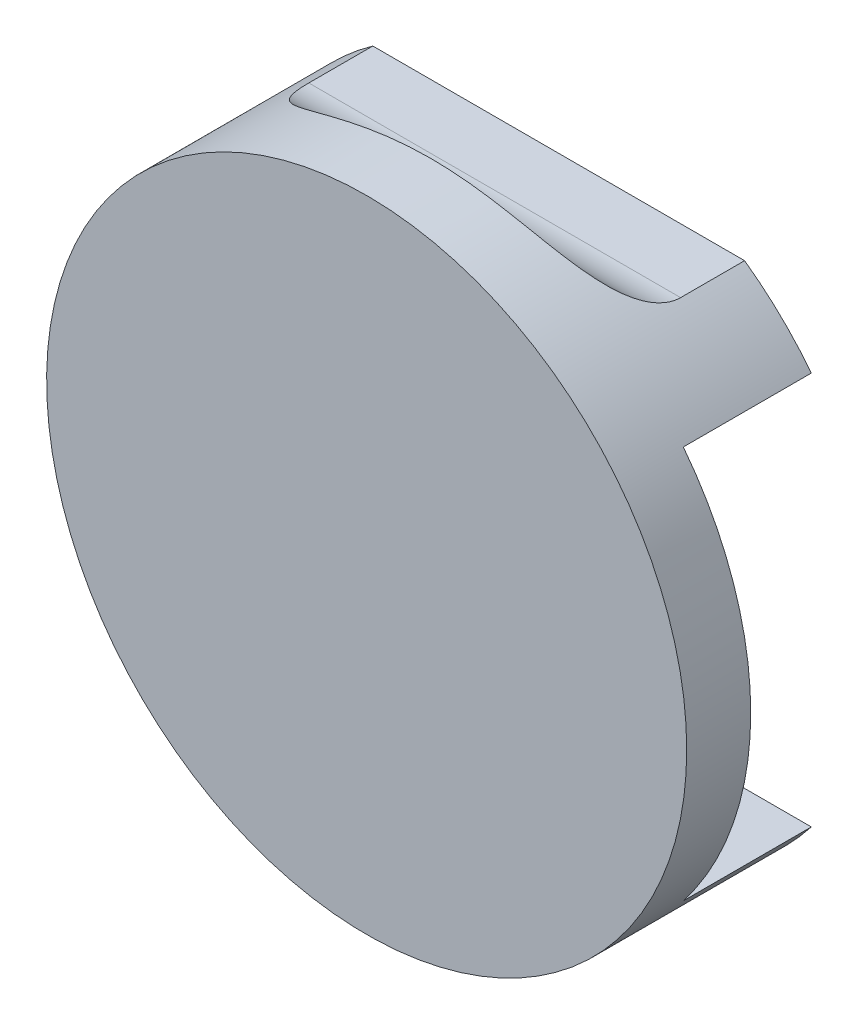
ISO-10303-21;
HEADER;
FILE_DESCRIPTION(('STEP AP214'),'2;1');
FILE_NAME('part.step','',(''),(''),'','','');
FILE_SCHEMA(('AUTOMOTIVE_DESIGN { 1 0 10303 214 1 1 1 1 }'));
ENDSEC;
DATA;
#1=APPLICATION_CONTEXT('core data for automotive mechanical design processes');
#2=APPLICATION_PROTOCOL_DEFINITION('international standard','automotive_design',2000,#1);
#3=PRODUCT_CONTEXT('',#1,'mechanical');
#4=PRODUCT('Part','Part','',(#3));
#5=PRODUCT_RELATED_PRODUCT_CATEGORY('part','',(#4));
#6=PRODUCT_DEFINITION_FORMATION('','',#4);
#7=PRODUCT_DEFINITION_CONTEXT('part definition',#1,'design');
#8=PRODUCT_DEFINITION('design','',#6,#7);
#9=PRODUCT_DEFINITION_SHAPE('','',#8);
#10=(LENGTH_UNIT() NAMED_UNIT(*) SI_UNIT(.MILLI.,.METRE.));
#11=(NAMED_UNIT(*) PLANE_ANGLE_UNIT() SI_UNIT($,.RADIAN.));
#12=(NAMED_UNIT(*) SI_UNIT($,.STERADIAN.) SOLID_ANGLE_UNIT());
#13=UNCERTAINTY_MEASURE_WITH_UNIT(LENGTH_MEASURE(1.E-05),#10,'distance_accuracy_value','');
#14=(GEOMETRIC_REPRESENTATION_CONTEXT(3) GLOBAL_UNCERTAINTY_ASSIGNED_CONTEXT((#13)) GLOBAL_UNIT_ASSIGNED_CONTEXT((#10,
#11,#12)) REPRESENTATION_CONTEXT('',''));
#15=CARTESIAN_POINT('',(0.,0.,0.));
#16=DIRECTION('',(0.,0.,1.));
#17=DIRECTION('',(1.,0.,0.));
#18=AXIS2_PLACEMENT_3D('',#15,#16,#17);
#19=CARTESIAN_POINT('',(0.,0.,-5.));
#20=DIRECTION('',(0.,0.,-1.));
#21=DIRECTION('',(1.,0.,0.));
#22=AXIS2_PLACEMENT_3D('',#19,#20,#21);
#23=PLANE('',#22);
#24=CARTESIAN_POINT('',(0.,0.,-5.));
#25=DIRECTION('',(0.,0.,1.));
#26=DIRECTION('',(1.,0.,0.));
#27=AXIS2_PLACEMENT_3D('',#24,#25,#26);
#28=CIRCLE('',#27,25.);
#29=CARTESIAN_POINT('',(-19.732650607559,15.35,-5.));
#30=VERTEX_POINT('',#29);
#31=CARTESIAN_POINT('',(-19.732650607559,-15.35,-5.));
#32=VERTEX_POINT('',#31);
#33=EDGE_CURVE('E167',#30,#32,#28,.T.);
#34=ORIENTED_EDGE('',*,*,#33,.F.);
#35=DIRECTION('',(1.,0.,0.));
#36=VECTOR('',#35,1.);
#37=CARTESIAN_POINT('',(-19.732650607559,15.35,-5.));
#38=LINE('',#37,#36);
#39=CARTESIAN_POINT('',(19.732650607559,15.35,-5.));
#40=VERTEX_POINT('',#39);
#41=EDGE_CURVE('E126',#30,#40,#38,.T.);
#42=ORIENTED_EDGE('',*,*,#41,.T.);
#43=CARTESIAN_POINT('',(19.732650607559,-15.35,-5.));
#44=VERTEX_POINT('',#43);
#45=EDGE_CURVE('E169',#44,#40,#28,.T.);
#46=ORIENTED_EDGE('',*,*,#45,.F.);
#47=DIRECTION('',(-1.,0.,0.));
#48=VECTOR('',#47,1.);
#49=CARTESIAN_POINT('',(-19.732650607559,-15.35,-5.));
#50=LINE('',#49,#48);
#51=EDGE_CURVE('E134',#44,#32,#50,.T.);
#52=ORIENTED_EDGE('',*,*,#51,.T.);
#53=EDGE_LOOP('',(#34,#42,#46,#52));
#54=FACE_BOUND('',#53,.T.);
#55=ADVANCED_FACE('F35',(#54),#23,.T.);
#56=CARTESIAN_POINT('',(0.,0.,-5.));
#57=DIRECTION('',(0.,0.,1.));
#58=DIRECTION('',(-1.,0.,0.));
#59=AXIS2_PLACEMENT_3D('',#56,#57,#58);
#60=CYLINDRICAL_SURFACE('',#59,25.);
#61=DIRECTION('',(0.,0.,1.));
#62=VECTOR('',#61,1.);
#63=CARTESIAN_POINT('',(-14.5216218102525,20.35,-15.));
#64=LINE('',#63,#62);
#65=CARTESIAN_POINT('',(-14.5216218102525,20.35,-15.));
#66=VERTEX_POINT('',#65);
#67=CARTESIAN_POINT('',(-14.5216218102525,20.35,-10.));
#68=VERTEX_POINT('',#67);
#69=EDGE_CURVE('E155',#66,#68,#64,.T.);
#70=ORIENTED_EDGE('',*,*,#69,.F.);
#71=CARTESIAN_POINT('',(0.,0.,-15.));
#72=DIRECTION('',(0.,0.,1.));
#73=DIRECTION('',(1.,0.,0.));
#74=AXIS2_PLACEMENT_3D('',#71,#72,#73);
#75=CIRCLE('',#74,25.);
#76=CARTESIAN_POINT('',(-19.732650607559,15.35,-15.));
#77=VERTEX_POINT('',#76);
#78=EDGE_CURVE('E145',#66,#77,#75,.T.);
#79=ORIENTED_EDGE('',*,*,#78,.T.);
#80=DIRECTION('',(0.,0.,1.));
#81=VECTOR('',#80,1.);
#82=CARTESIAN_POINT('',(-19.732650607559,15.35,-15.));
#83=LINE('',#82,#81);
#84=EDGE_CURVE('E164',#77,#30,#83,.T.);
#85=ORIENTED_EDGE('',*,*,#84,.T.);
#86=ORIENTED_EDGE('',*,*,#33,.T.);
#87=DIRECTION('',(0.,0.,1.));
#88=VECTOR('',#87,1.);
#89=CARTESIAN_POINT('',(-19.732650607559,-15.35,-15.));
#90=LINE('',#89,#88);
#91=CARTESIAN_POINT('',(-19.732650607559,-15.35,-15.));
#92=VERTEX_POINT('',#91);
#93=EDGE_CURVE('E133',#92,#32,#90,.T.);
#94=ORIENTED_EDGE('',*,*,#93,.F.);
#95=CARTESIAN_POINT('',(0.,0.,-15.));
#96=DIRECTION('',(0.,0.,1.));
#97=DIRECTION('',(-1.,0.,0.));
#98=AXIS2_PLACEMENT_3D('',#95,#96,#97);
#99=CIRCLE('',#98,25.);
#100=CARTESIAN_POINT('',(-14.5216218102525,-20.35,-15.));
#101=VERTEX_POINT('',#100);
#102=EDGE_CURVE('E116',#92,#101,#99,.T.);
#103=ORIENTED_EDGE('',*,*,#102,.T.);
#104=DIRECTION('',(0.,0.,1.));
#105=VECTOR('',#104,1.);
#106=CARTESIAN_POINT('',(-14.5216218102525,-20.35,-15.));
#107=LINE('',#106,#105);
#108=CARTESIAN_POINT('',(-14.5216218102525,-20.35,-10.));
#109=VERTEX_POINT('',#108);
#110=EDGE_CURVE('E123',#101,#109,#107,.T.);
#111=ORIENTED_EDGE('',*,*,#110,.T.);
#112=CARTESIAN_POINT('',(14.5216218102525,-20.35,-10.));
#113=CARTESIAN_POINT('',(14.5216516923995,-20.3499714724112,-9.90243900627181));
#114=CARTESIAN_POINT('',(14.5176214833419,-20.3528544616636,-9.80490103199293));
#115=CARTESIAN_POINT('',(14.5016729744672,-20.3642248665384,-9.61089436509274));
#116=CARTESIAN_POINT('',(14.4897623888502,-20.3727068012637,-9.51442472047562));
#117=CARTESIAN_POINT('',(14.4584484267827,-20.3949408021018,-9.32437913075647));
#118=CARTESIAN_POINT('',(14.4391244348287,-20.4086370209626,-9.23078350576052));
#119=CARTESIAN_POINT('',(14.3933906550105,-20.4409171214255,-9.0462201471187));
#120=CARTESIAN_POINT('',(14.3669796269597,-20.4595018584763,-8.95525287650742));
#121=CARTESIAN_POINT('',(14.2780299320764,-20.5217709072939,-8.68794519812128));
#122=CARTESIAN_POINT('',(14.2056230108338,-20.5720797369634,-8.51631655785808));
#123=CARTESIAN_POINT('',(14.0387802982028,-20.6862973737273,-8.18887567437971));
#124=CARTESIAN_POINT('',(13.9442853774472,-20.7502426444307,-8.03310752533815));
#125=CARTESIAN_POINT('',(13.6919128216938,-20.9180105577739,-7.67356335169646));
#126=CARTESIAN_POINT('',(13.5244560885488,-21.0269869449647,-7.47888834620155));
#127=CARTESIAN_POINT('',(13.2537078079582,-21.1978974275088,-7.21230431590257));
#128=CARTESIAN_POINT('',(13.1600614586412,-21.2561903384449,-7.12758623592491));
#129=CARTESIAN_POINT('',(12.9671410135791,-21.3744241421331,-6.96605978331645));
#130=CARTESIAN_POINT('',(12.8678678779717,-21.4343647528331,-6.8892500674887));
#131=CARTESIAN_POINT('',(12.6013971298552,-21.5926254984877,-6.6976053249203));
#132=CARTESIAN_POINT('',(12.4303046839586,-21.691662148574,-6.58878012054556));
#133=CARTESIAN_POINT('',(12.0783272440861,-21.8896063175565,-6.38813926309017));
#134=CARTESIAN_POINT('',(11.8974359433717,-21.9885137103006,-6.29633473705204));
#135=CARTESIAN_POINT('',(11.5276582562348,-22.184611172198,-6.1273930114258));
#136=CARTESIAN_POINT('',(11.3387593217715,-22.2817981802464,-6.05027995674777));
#137=CARTESIAN_POINT('',(10.9546858820607,-22.4731155272541,-5.90882774362362));
#138=CARTESIAN_POINT('',(10.7595090061419,-22.5672446838894,-5.84449347808485));
#139=CARTESIAN_POINT('',(10.3750734682458,-22.7464350256905,-5.7300930920407));
#140=CARTESIAN_POINT('',(10.1860889455795,-22.8317094180181,-5.6794326196711));
#141=CARTESIAN_POINT('',(9.80435029529547,-22.9982190016967,-5.58658759994817));
#142=CARTESIAN_POINT('',(9.61159672855235,-23.0794547877577,-5.5444018018474));
#143=CARTESIAN_POINT('',(9.22270784692529,-23.237593598521,-5.46728716884823));
#144=CARTESIAN_POINT('',(9.02656987230216,-23.3144929919608,-5.43236435202442));
#145=CARTESIAN_POINT('',(8.63151312302899,-23.4636226705657,-5.36878663083949));
#146=CARTESIAN_POINT('',(8.43259401532592,-23.5358523905896,-5.34013248413932));
#147=CARTESIAN_POINT('',(7.83174350851581,-23.7453946533391,-5.26211247126874));
#148=CARTESIAN_POINT('',(7.42617884573038,-23.8753729655037,-5.2207753765069));
#149=CARTESIAN_POINT('',(6.60799054978018,-24.1146477607422,-5.15342531179937));
#150=CARTESIAN_POINT('',(6.19536892425952,-24.2239500226601,-5.1274080557337));
#151=CARTESIAN_POINT('',(5.30770460715272,-24.4348898934871,-5.08311467280315));
#152=CARTESIAN_POINT('',(4.83184837066626,-24.5334306737602,-5.06638553109534));
#153=CARTESIAN_POINT('',(3.87497303091428,-24.7026461510271,-5.04134835175687));
#154=CARTESIAN_POINT('',(3.39395336246248,-24.7733177648595,-5.03304124569507));
#155=CARTESIAN_POINT('',(2.42828723732252,-24.8865404153771,-5.0212006136867));
#156=CARTESIAN_POINT('',(1.94363885703016,-24.9290752847027,-5.01766983099781));
#157=CARTESIAN_POINT('',(0.972648892521844,-24.98580491911,-5.01319846626932));
#158=CARTESIAN_POINT('',(0.486307271558874,-24.9999990652471,-5.01225794079924));
#159=CARTESIAN_POINT('',(-0.34671713901242,-25.0000006664405,-5.01227010679755));
#160=CARTESIAN_POINT('',(-0.693416817861546,-24.992786774291,-5.01275685964154));
#161=CARTESIAN_POINT('',(-1.3862435616551,-24.9639446310412,-5.01490380608671));
#162=CARTESIAN_POINT('',(-1.73237059010361,-24.9423154942146,-5.01656407179326));
#163=CARTESIAN_POINT('',(-2.42362988337364,-24.8846617381894,-5.0216172567383));
#164=CARTESIAN_POINT('',(-2.76876138157176,-24.8486280328819,-5.02501126996564));
#165=CARTESIAN_POINT('',(-3.45718173114511,-24.7622340071756,-5.03447674603174));
#166=CARTESIAN_POINT('',(-3.80047064336267,-24.7118741628294,-5.04054811990644));
#167=CARTESIAN_POINT('',(-4.48343599926657,-24.5971198652688,-5.05666932071661));
#168=CARTESIAN_POINT('',(-4.82312064111081,-24.5327724397554,-5.06670590646896));
#169=CARTESIAN_POINT('',(-5.49936502871441,-24.3900881633954,-5.09247219872061));
#170=CARTESIAN_POINT('',(-5.83592449306507,-24.3117500653566,-5.1082024129043));
#171=CARTESIAN_POINT('',(-6.50472251044301,-24.1414070216506,-5.14748145228679));
#172=CARTESIAN_POINT('',(-6.83696540799312,-24.0494171995019,-5.17102166070541));
#173=CARTESIAN_POINT('',(-7.49648662463607,-23.8520666279075,-5.22854568126741));
#174=CARTESIAN_POINT('',(-7.82376634335692,-23.7467097295704,-5.2625264894248));
#175=CARTESIAN_POINT('',(-8.34639645379091,-23.5665388492418,-5.32832505344769));
#176=CARTESIAN_POINT('',(-8.54367575946218,-23.4957307281106,-5.3558685165578));
#177=CARTESIAN_POINT('',(-8.9355701050413,-23.3495034372951,-5.41695529787412));
#178=CARTESIAN_POINT('',(-9.13018540667768,-23.2740847246221,-5.450498022054));
#179=CARTESIAN_POINT('',(-9.51681625117018,-23.1186876587383,-5.5246590258549));
#180=CARTESIAN_POINT('',(-9.70882411159728,-23.0386984168181,-5.56529472027724));
#181=CARTESIAN_POINT('',(-10.0892067327021,-22.8746762651763,-5.65471564050041));
#182=CARTESIAN_POINT('',(-10.2775812510787,-22.7906430870689,-5.7035014077335));
#183=CARTESIAN_POINT('',(-10.6940722559844,-22.5986957539351,-5.82316041586874));
#184=CARTESIAN_POINT('',(-10.921049982739,-22.4898344027009,-5.89652861599841));
#185=CARTESIAN_POINT('',(-11.3667859740614,-22.2678729599111,-6.06051432624466));
#186=CARTESIAN_POINT('',(-11.58554022042,-22.1547708487631,-6.1511401410079));
#187=CARTESIAN_POINT('',(-12.0113343865606,-21.9268297380312,-6.35240805878191));
#188=CARTESIAN_POINT('',(-12.2184229870933,-21.8120009570067,-6.46295740579907));
#189=CARTESIAN_POINT('',(-12.6183098682107,-21.5831220578433,-6.70778405105816));
#190=CARTESIAN_POINT('',(-12.8111282680551,-21.4690710575005,-6.84202700340795));
#191=CARTESIAN_POINT('',(-13.153903571847,-21.2605193321099,-7.11867076336139));
#192=CARTESIAN_POINT('',(-13.3061687584127,-21.1654115202872,-7.25771272909903));
#193=CARTESIAN_POINT('',(-13.5920572866386,-20.9829625362129,-7.55868873691378));
#194=CARTESIAN_POINT('',(-13.7256716913447,-20.8956250945331,-7.7206336791705));
#195=CARTESIAN_POINT('',(-13.969926912868,-20.7331368645016,-8.0707274211692));
#196=CARTESIAN_POINT('',(-14.0802515436404,-20.6581565018536,-8.25918529170804));
#197=CARTESIAN_POINT('',(-14.2209875002086,-20.5612934256962,-8.55803225890751));
#198=CARTESIAN_POINT('',(-14.2637406192793,-20.5316312231127,-8.66021920109311));
#199=CARTESIAN_POINT('',(-14.3402026377994,-20.4782996492524,-8.86944472195148));
#200=CARTESIAN_POINT('',(-14.3739158156824,-20.454627443323,-8.97648097739643));
#201=CARTESIAN_POINT('',(-14.4220874441203,-20.4206747348683,-9.15895476837893));
#202=CARTESIAN_POINT('',(-14.4392423748917,-20.4085425694188,-9.23335116605105));
#203=CARTESIAN_POINT('',(-14.468837266532,-20.3875716015334,-9.38351995801654));
#204=CARTESIAN_POINT('',(-14.4812787163047,-20.3787317591269,-9.45929190985842));
#205=CARTESIAN_POINT('',(-14.5013409645407,-20.3644610042783,-9.61227404186909));
#206=CARTESIAN_POINT('',(-14.5089313282383,-20.3590516154371,-9.68949023322893));
#207=CARTESIAN_POINT('',(-14.5190796094078,-20.3518140225531,-9.84446820118627));
#208=CARTESIAN_POINT('',(-14.5216343003175,-20.3499881145967,-9.92223029556868));
#209=CARTESIAN_POINT('',(-14.5216218102525,-20.35,-10.));
#210=B_SPLINE_CURVE_WITH_KNOTS('',3,(#112,#113,#114,#115,#116,#117,#118,#119,#120,#121,#122,
#123,#124,#125,#126,#127,#128,#129,#130,#131,#132,#133,#134,#135,#136,#137,#138,#139,#140,#141,
#142,#143,#144,#145,#146,#147,#148,#149,#150,#151,#152,#153,#154,#155,#156,#157,#158,#159,#160,
#161,#162,#163,#164,#165,#166,#167,#168,#169,#170,#171,#172,#173,#174,#175,#176,#177,#178,#179,
#180,#181,#182,#183,#184,#185,#186,#187,#188,#189,#190,#191,#192,#193,#194,#195,#196,#197,#198,
#199,#200,#201,#202,#203,#204,#205,#206,#207,#208,#209),.UNSPECIFIED.,.F.,.F.,(4,2,2,2,2,2,2,2,
2,2,2,2,2,2,2,2,2,2,2,2,2,2,2,2,2,2,2,2,2,2,2,2,2,2,2,2,2,2,2,2,2,2,2,2,2,2,2,2,4),(0.,
0.29251995502069,0.584753981399756,0.873942309821987,1.16318127742063,1.73899303055195,
2.31636424600612,3.14821752708743,3.56524495778431,3.98220144116351,4.65810653957343,
5.33445195582071,6.0118995101745,6.68960595646517,7.32963922299213,7.96957795974437,
8.61004485272044,9.25058911282249,10.5331861205216,11.8154241179224,13.2731676564417,
14.7310724196833,16.1898141682981,17.6485877746187,18.6886335251767,19.7287431859119,
20.7695099645422,21.8102421629063,22.8475279877528,23.8849063271729,24.9211439104466,
25.9570836245479,26.5911664620937,27.2251865496484,27.8607857727334,28.4964272372672,
29.2824175392958,30.0687870329245,30.8515858769157,31.6332591701271,32.3127784949128,
32.992622317513,33.6811741354416,34.0246900415259,34.3680430798935,34.5997610328093,
34.8314057290444,35.0644898107987,35.297723190607),.UNSPECIFIED.);
#211=CARTESIAN_POINT('',(14.5216218102525,-20.35,-10.));
#212=VERTEX_POINT('',#211);
#213=EDGE_CURVE('E50',#212,#109,#210,.T.);
#214=ORIENTED_EDGE('',*,*,#213,.F.);
#215=DIRECTION('',(0.,0.,1.));
#216=VECTOR('',#215,1.);
#217=CARTESIAN_POINT('',(14.5216218102525,-20.35,-15.));
#218=LINE('',#217,#216);
#219=CARTESIAN_POINT('',(14.5216218102525,-20.35,-15.));
#220=VERTEX_POINT('',#219);
#221=EDGE_CURVE('E127',#220,#212,#218,.T.);
#222=ORIENTED_EDGE('',*,*,#221,.F.);
#223=CARTESIAN_POINT('',(0.,0.,-15.));
#224=DIRECTION('',(0.,0.,1.));
#225=DIRECTION('',(-1.,0.,0.));
#226=AXIS2_PLACEMENT_3D('',#223,#224,#225);
#227=CIRCLE('',#226,25.);
#228=CARTESIAN_POINT('',(19.732650607559,-15.35,-15.));
#229=VERTEX_POINT('',#228);
#230=EDGE_CURVE('E118',#220,#229,#227,.T.);
#231=ORIENTED_EDGE('',*,*,#230,.T.);
#232=DIRECTION('',(0.,0.,1.));
#233=VECTOR('',#232,1.);
#234=CARTESIAN_POINT('',(19.732650607559,-15.35,-15.));
#235=LINE('',#234,#233);
#236=EDGE_CURVE('E75',#229,#44,#235,.T.);
#237=ORIENTED_EDGE('',*,*,#236,.T.);
#238=ORIENTED_EDGE('',*,*,#45,.T.);
#239=DIRECTION('',(0.,0.,1.));
#240=VECTOR('',#239,1.);
#241=CARTESIAN_POINT('',(19.732650607559,15.35,-15.));
#242=LINE('',#241,#240);
#243=CARTESIAN_POINT('',(19.732650607559,15.35,-15.));
#244=VERTEX_POINT('',#243);
#245=EDGE_CURVE('E162',#244,#40,#242,.T.);
#246=ORIENTED_EDGE('',*,*,#245,.F.);
#247=CARTESIAN_POINT('',(0.,0.,-15.));
#248=DIRECTION('',(0.,0.,1.));
#249=DIRECTION('',(1.,0.,0.));
#250=AXIS2_PLACEMENT_3D('',#247,#248,#249);
#251=CIRCLE('',#250,25.);
#252=CARTESIAN_POINT('',(14.5216218102525,20.35,-15.));
#253=VERTEX_POINT('',#252);
#254=EDGE_CURVE('E150',#244,#253,#251,.T.);
#255=ORIENTED_EDGE('',*,*,#254,.T.);
#256=DIRECTION('',(0.,0.,1.));
#257=VECTOR('',#256,1.);
#258=CARTESIAN_POINT('',(14.5216218102525,20.35,-15.));
#259=LINE('',#258,#257);
#260=CARTESIAN_POINT('',(14.5216218102525,20.35,-10.));
#261=VERTEX_POINT('',#260);
#262=EDGE_CURVE('E159',#253,#261,#259,.T.);
#263=ORIENTED_EDGE('',*,*,#262,.T.);
#264=CARTESIAN_POINT('',(-14.5216218102525,20.35,-10.));
#265=CARTESIAN_POINT('',(-14.5216516923995,20.3499714724112,-9.90243900627181));
#266=CARTESIAN_POINT('',(-14.5176214833419,20.3528544616636,-9.80490103199293));
#267=CARTESIAN_POINT('',(-14.5016729744672,20.3642248665384,-9.61089436509274));
#268=CARTESIAN_POINT('',(-14.4897623888502,20.3727068012637,-9.51442472047562));
#269=CARTESIAN_POINT('',(-14.4584484267827,20.3949408021018,-9.32437913075647));
#270=CARTESIAN_POINT('',(-14.4391244348287,20.4086370209626,-9.23078350576052));
#271=CARTESIAN_POINT('',(-14.3933906550105,20.4409171214255,-9.0462201471187));
#272=CARTESIAN_POINT('',(-14.3669796269597,20.4595018584763,-8.95525287650742));
#273=CARTESIAN_POINT('',(-14.2780299320764,20.5217709072939,-8.68794519812128));
#274=CARTESIAN_POINT('',(-14.2056230108338,20.5720797369634,-8.51631655785808));
#275=CARTESIAN_POINT('',(-14.0387802982028,20.6862973737273,-8.18887567437971));
#276=CARTESIAN_POINT('',(-13.9442853774472,20.7502426444307,-8.03310752533815));
#277=CARTESIAN_POINT('',(-13.6919128216938,20.9180105577739,-7.67356335169646));
#278=CARTESIAN_POINT('',(-13.5244560885488,21.0269869449647,-7.47888834620155));
#279=CARTESIAN_POINT('',(-13.2537078079582,21.1978974275088,-7.21230431590257));
#280=CARTESIAN_POINT('',(-13.1600614586412,21.2561903384449,-7.12758623592491));
#281=CARTESIAN_POINT('',(-12.9671410135791,21.3744241421331,-6.96605978331645));
#282=CARTESIAN_POINT('',(-12.8678678779717,21.4343647528331,-6.8892500674887));
#283=CARTESIAN_POINT('',(-12.6013971298552,21.5926254984877,-6.6976053249203));
#284=CARTESIAN_POINT('',(-12.4303046839586,21.691662148574,-6.58878012054556));
#285=CARTESIAN_POINT('',(-12.0783272440861,21.8896063175565,-6.38813926309017));
#286=CARTESIAN_POINT('',(-11.8974359433717,21.9885137103006,-6.29633473705204));
#287=CARTESIAN_POINT('',(-11.5276582562348,22.184611172198,-6.1273930114258));
#288=CARTESIAN_POINT('',(-11.3387593217715,22.2817981802464,-6.05027995674777));
#289=CARTESIAN_POINT('',(-10.9546858820607,22.4731155272541,-5.90882774362362));
#290=CARTESIAN_POINT('',(-10.7595090061419,22.5672446838894,-5.84449347808485));
#291=CARTESIAN_POINT('',(-10.3750734682458,22.7464350256905,-5.7300930920407));
#292=CARTESIAN_POINT('',(-10.1860889455795,22.8317094180181,-5.6794326196711));
#293=CARTESIAN_POINT('',(-9.80435029529547,22.9982190016967,-5.58658759994817));
#294=CARTESIAN_POINT('',(-9.61159672855235,23.0794547877577,-5.5444018018474));
#295=CARTESIAN_POINT('',(-9.22270784692529,23.237593598521,-5.46728716884823));
#296=CARTESIAN_POINT('',(-9.02656987230216,23.3144929919608,-5.43236435202442));
#297=CARTESIAN_POINT('',(-8.63151312302899,23.4636226705657,-5.36878663083949));
#298=CARTESIAN_POINT('',(-8.43259401532592,23.5358523905896,-5.34013248413932));
#299=CARTESIAN_POINT('',(-7.83174350851581,23.7453946533391,-5.26211247126874));
#300=CARTESIAN_POINT('',(-7.42617884573038,23.8753729655037,-5.2207753765069));
#301=CARTESIAN_POINT('',(-6.60799054978018,24.1146477607422,-5.15342531179937));
#302=CARTESIAN_POINT('',(-6.19536892425952,24.2239500226601,-5.1274080557337));
#303=CARTESIAN_POINT('',(-5.30770460715272,24.4348898934871,-5.08311467280315));
#304=CARTESIAN_POINT('',(-4.83184837066626,24.5334306737602,-5.06638553109534));
#305=CARTESIAN_POINT('',(-3.87497303091428,24.7026461510271,-5.04134835175687));
#306=CARTESIAN_POINT('',(-3.39395336246248,24.7733177648595,-5.03304124569507));
#307=CARTESIAN_POINT('',(-2.42828723732253,24.8865404153771,-5.0212006136867));
#308=CARTESIAN_POINT('',(-1.94363885703017,24.9290752847027,-5.01766983099781));
#309=CARTESIAN_POINT('',(-0.972648892521851,24.98580491911,-5.01319846626932));
#310=CARTESIAN_POINT('',(-0.486307271558883,24.9999990652471,-5.01225794079924));
#311=CARTESIAN_POINT('',(0.346717139012412,25.0000006664405,-5.01227010679755));
#312=CARTESIAN_POINT('',(0.693416817861538,24.992786774291,-5.01275685964154));
#313=CARTESIAN_POINT('',(1.38624356165509,24.9639446310412,-5.01490380608671));
#314=CARTESIAN_POINT('',(1.7323705901036,24.9423154942146,-5.01656407179325));
#315=CARTESIAN_POINT('',(2.42362988337364,24.8846617381894,-5.0216172567383));
#316=CARTESIAN_POINT('',(2.76876138157175,24.8486280328819,-5.02501126996564));
#317=CARTESIAN_POINT('',(3.45718173114511,24.7622340071756,-5.03447674603174));
#318=CARTESIAN_POINT('',(3.80047064336267,24.7118741628294,-5.04054811990644));
#319=CARTESIAN_POINT('',(4.48343599926657,24.5971198652688,-5.05666932071661));
#320=CARTESIAN_POINT('',(4.8231206411108,24.5327724397554,-5.06670590646896));
#321=CARTESIAN_POINT('',(5.49936502871441,24.3900881633954,-5.09247219872061));
#322=CARTESIAN_POINT('',(5.83592449306507,24.3117500653566,-5.1082024129043));
#323=CARTESIAN_POINT('',(6.504722510443,24.1414070216506,-5.14748145228679));
#324=CARTESIAN_POINT('',(6.83696540799312,24.0494171995019,-5.17102166070541));
#325=CARTESIAN_POINT('',(7.49648662463607,23.8520666279075,-5.22854568126741));
#326=CARTESIAN_POINT('',(7.82376634335692,23.7467097295704,-5.2625264894248));
#327=CARTESIAN_POINT('',(8.3463964537909,23.5665388492418,-5.32832505344769));
#328=CARTESIAN_POINT('',(8.54367575946218,23.4957307281106,-5.3558685165578));
#329=CARTESIAN_POINT('',(8.9355701050413,23.3495034372951,-5.41695529787411));
#330=CARTESIAN_POINT('',(9.13018540667768,23.2740847246221,-5.450498022054));
#331=CARTESIAN_POINT('',(9.51681625117018,23.1186876587383,-5.5246590258549));
#332=CARTESIAN_POINT('',(9.70882411159728,23.0386984168181,-5.56529472027724));
#333=CARTESIAN_POINT('',(10.0892067327021,22.8746762651763,-5.65471564050041));
#334=CARTESIAN_POINT('',(10.2775812510787,22.7906430870689,-5.7035014077335));
#335=CARTESIAN_POINT('',(10.6940722559844,22.5986957539351,-5.82316041586874));
#336=CARTESIAN_POINT('',(10.921049982739,22.4898344027009,-5.89652861599841));
#337=CARTESIAN_POINT('',(11.3667859740614,22.2678729599111,-6.06051432624465));
#338=CARTESIAN_POINT('',(11.5855402204199,22.1547708487631,-6.1511401410079));
#339=CARTESIAN_POINT('',(12.0113343865606,21.9268297380312,-6.3524080587819));
#340=CARTESIAN_POINT('',(12.2184229870933,21.8120009570067,-6.46295740579907));
#341=CARTESIAN_POINT('',(12.6183098682107,21.5831220578433,-6.70778405105816));
#342=CARTESIAN_POINT('',(12.8111282680551,21.4690710575005,-6.84202700340795));
#343=CARTESIAN_POINT('',(13.153903571847,21.2605193321099,-7.11867076336138));
#344=CARTESIAN_POINT('',(13.3061687584127,21.1654115202872,-7.25771272909902));
#345=CARTESIAN_POINT('',(13.5920572866386,20.9829625362129,-7.55868873691377));
#346=CARTESIAN_POINT('',(13.7256716913447,20.8956250945331,-7.7206336791705));
#347=CARTESIAN_POINT('',(13.969926912868,20.7331368645016,-8.07072742116919));
#348=CARTESIAN_POINT('',(14.0802515436404,20.6581565018536,-8.25918529170803));
#349=CARTESIAN_POINT('',(14.2209875002086,20.5612934256962,-8.5580322589075));
#350=CARTESIAN_POINT('',(14.2637406192793,20.5316312231127,-8.6602192010931));
#351=CARTESIAN_POINT('',(14.3402026377994,20.4782996492524,-8.86944472195147));
#352=CARTESIAN_POINT('',(14.3739158156824,20.454627443323,-8.97648097739643));
#353=CARTESIAN_POINT('',(14.4220874441203,20.4206747348683,-9.15895476837892));
#354=CARTESIAN_POINT('',(14.4392423748917,20.4085425694188,-9.23335116605105));
#355=CARTESIAN_POINT('',(14.468837266532,20.3875716015334,-9.38351995801654));
#356=CARTESIAN_POINT('',(14.4812787163047,20.3787317591269,-9.45929190985841));
#357=CARTESIAN_POINT('',(14.5013409645407,20.3644610042783,-9.61227404186909));
#358=CARTESIAN_POINT('',(14.5089313282383,20.3590516154371,-9.68949023322893));
#359=CARTESIAN_POINT('',(14.5190796094078,20.3518140225531,-9.84446820118627));
#360=CARTESIAN_POINT('',(14.5216343003175,20.3499881145967,-9.92223029556868));
#361=CARTESIAN_POINT('',(14.5216218102525,20.35,-10.));
#362=B_SPLINE_CURVE_WITH_KNOTS('',3,(#264,#265,#266,#267,#268,#269,#270,#271,#272,#273,#274,
#275,#276,#277,#278,#279,#280,#281,#282,#283,#284,#285,#286,#287,#288,#289,#290,#291,#292,#293,
#294,#295,#296,#297,#298,#299,#300,#301,#302,#303,#304,#305,#306,#307,#308,#309,#310,#311,#312,
#313,#314,#315,#316,#317,#318,#319,#320,#321,#322,#323,#324,#325,#326,#327,#328,#329,#330,#331,
#332,#333,#334,#335,#336,#337,#338,#339,#340,#341,#342,#343,#344,#345,#346,#347,#348,#349,#350,
#351,#352,#353,#354,#355,#356,#357,#358,#359,#360,#361),.UNSPECIFIED.,.F.,.F.,(4,2,2,2,2,2,2,2,
2,2,2,2,2,2,2,2,2,2,2,2,2,2,2,2,2,2,2,2,2,2,2,2,2,2,2,2,2,2,2,2,2,2,2,2,2,2,2,2,4),(0.,
0.29251995502069,0.584753981399756,0.873942309821987,1.16318127742063,1.73899303055195,
2.31636424600612,3.14821752708743,3.56524495778431,3.98220144116351,4.65810653957343,
5.33445195582071,6.0118995101745,6.68960595646517,7.32963922299213,7.96957795974437,
8.61004485272044,9.25058911282249,10.5331861205216,11.8154241179224,13.2731676564417,
14.7310724196833,16.1898141682981,17.6485877746186,18.6886335251767,19.7287431859119,
20.7695099645422,21.8102421629063,22.8475279877528,23.8849063271729,24.9211439104466,
25.9570836245479,26.5911664620937,27.2251865496484,27.8607857727334,28.4964272372672,
29.2824175392958,30.0687870329245,30.8515858769157,31.6332591701271,32.3127784949128,
32.992622317513,33.6811741354416,34.0246900415259,34.3680430798935,34.5997610328093,
34.8314057290444,35.0644898107987,35.297723190607),.UNSPECIFIED.);
#363=EDGE_CURVE('E11',#68,#261,#362,.T.);
#364=ORIENTED_EDGE('',*,*,#363,.F.);
#365=EDGE_LOOP('',(#70,#79,#85,#86,#94,#103,#111,#214,#222,#231,#237,#238,#246,#255,#263,#364));
#366=FACE_BOUND('',#365,.T.);
#367=CARTESIAN_POINT('',(0.,0.,0.));
#368=DIRECTION('',(0.,0.,1.));
#369=DIRECTION('',(1.,0.,0.));
#370=AXIS2_PLACEMENT_3D('',#367,#368,#369);
#371=CIRCLE('',#370,25.);
#372=CARTESIAN_POINT('',(25.,0.,0.));
#373=VERTEX_POINT('',#372);
#374=EDGE_CURVE('E166',#373,#373,#371,.T.);
#375=ORIENTED_EDGE('',*,*,#374,.F.);
#376=EDGE_LOOP('',(#375));
#377=FACE_BOUND('',#376,.T.);
#378=ADVANCED_FACE('F130',(#366,#377),#60,.T.);
#379=CARTESIAN_POINT('',(0.,0.,0.));
#380=DIRECTION('',(0.,0.,-1.));
#381=DIRECTION('',(1.,0.,0.));
#382=AXIS2_PLACEMENT_3D('',#379,#380,#381);
#383=PLANE('',#382);
#384=ORIENTED_EDGE('',*,*,#374,.T.);
#385=EDGE_LOOP('',(#384));
#386=FACE_BOUND('',#385,.T.);
#387=ADVANCED_FACE('F182',(#386),#383,.F.);
#388=CARTESIAN_POINT('',(-19.732650607559,15.35,-15.));
#389=DIRECTION('',(0.,1.,0.));
#390=DIRECTION('',(0.,0.,-1.));
#391=AXIS2_PLACEMENT_3D('',#388,#389,#390);
#392=PLANE('',#391);
#393=ORIENTED_EDGE('',*,*,#41,.F.);
#394=ORIENTED_EDGE('',*,*,#84,.F.);
#395=DIRECTION('',(1.,0.,0.));
#396=VECTOR('',#395,1.);
#397=CARTESIAN_POINT('',(-19.732650607559,15.35,-15.));
#398=LINE('',#397,#396);
#399=EDGE_CURVE('E148',#77,#244,#398,.T.);
#400=ORIENTED_EDGE('',*,*,#399,.T.);
#401=ORIENTED_EDGE('',*,*,#245,.T.);
#402=EDGE_LOOP('',(#393,#394,#400,#401));
#403=FACE_BOUND('',#402,.T.);
#404=ADVANCED_FACE('F186',(#403),#392,.F.);
#405=CARTESIAN_POINT('',(-14.5216218102525,20.35,-15.));
#406=DIRECTION('',(0.,-1.,0.));
#407=DIRECTION('',(0.,0.,1.));
#408=AXIS2_PLACEMENT_3D('',#405,#406,#407);
#409=PLANE('',#408);
#410=ORIENTED_EDGE('',*,*,#262,.F.);
#411=DIRECTION('',(-1.,0.,0.));
#412=VECTOR('',#411,1.);
#413=CARTESIAN_POINT('',(-14.5216218102525,20.35,-15.));
#414=LINE('',#413,#412);
#415=EDGE_CURVE('E153',#253,#66,#414,.T.);
#416=ORIENTED_EDGE('',*,*,#415,.T.);
#417=ORIENTED_EDGE('',*,*,#69,.T.);
#418=DIRECTION('',(-1.,0.,0.));
#419=VECTOR('',#418,1.);
#420=CARTESIAN_POINT('',(-14.5216218102525,20.35,-10.));
#421=LINE('',#420,#419);
#422=EDGE_CURVE('E57',#261,#68,#421,.T.);
#423=ORIENTED_EDGE('',*,*,#422,.F.);
#424=EDGE_LOOP('',(#410,#416,#417,#423));
#425=FACE_BOUND('',#424,.T.);
#426=ADVANCED_FACE('F193',(#425),#409,.F.);
#427=CARTESIAN_POINT('',(0.,0.,-15.));
#428=DIRECTION('',(0.,0.,-1.));
#429=DIRECTION('',(1.,0.,0.));
#430=AXIS2_PLACEMENT_3D('',#427,#428,#429);
#431=PLANE('',#430);
#432=ORIENTED_EDGE('',*,*,#78,.F.);
#433=ORIENTED_EDGE('',*,*,#415,.F.);
#434=ORIENTED_EDGE('',*,*,#254,.F.);
#435=ORIENTED_EDGE('',*,*,#399,.F.);
#436=EDGE_LOOP('',(#432,#433,#434,#435));
#437=FACE_BOUND('',#436,.T.);
#438=ADVANCED_FACE('F197',(#437),#431,.T.);
#439=CARTESIAN_POINT('',(-14.5216218102525,-20.35,-15.));
#440=DIRECTION('',(0.,1.,0.));
#441=DIRECTION('',(0.,0.,-1.));
#442=AXIS2_PLACEMENT_3D('',#439,#440,#441);
#443=PLANE('',#442);
#444=ORIENTED_EDGE('',*,*,#110,.F.);
#445=DIRECTION('',(1.,0.,0.));
#446=VECTOR('',#445,1.);
#447=CARTESIAN_POINT('',(-14.5216218102525,-20.35,-15.));
#448=LINE('',#447,#446);
#449=EDGE_CURVE('E112',#101,#220,#448,.T.);
#450=ORIENTED_EDGE('',*,*,#449,.T.);
#451=ORIENTED_EDGE('',*,*,#221,.T.);
#452=DIRECTION('',(1.,0.,0.));
#453=VECTOR('',#452,1.);
#454=CARTESIAN_POINT('',(-14.5216218102525,-20.35,-10.));
#455=LINE('',#454,#453);
#456=EDGE_CURVE('E67',#109,#212,#455,.T.);
#457=ORIENTED_EDGE('',*,*,#456,.F.);
#458=EDGE_LOOP('',(#444,#450,#451,#457));
#459=FACE_BOUND('',#458,.T.);
#460=ADVANCED_FACE('F124',(#459),#443,.F.);
#461=CARTESIAN_POINT('',(-19.732650607559,-15.35,-15.));
#462=DIRECTION('',(0.,-1.,0.));
#463=DIRECTION('',(0.,0.,1.));
#464=AXIS2_PLACEMENT_3D('',#461,#462,#463);
#465=PLANE('',#464);
#466=ORIENTED_EDGE('',*,*,#51,.F.);
#467=ORIENTED_EDGE('',*,*,#236,.F.);
#468=DIRECTION('',(-1.,0.,0.));
#469=VECTOR('',#468,1.);
#470=CARTESIAN_POINT('',(-19.732650607559,-15.35,-15.));
#471=LINE('',#470,#469);
#472=EDGE_CURVE('E140',#229,#92,#471,.T.);
#473=ORIENTED_EDGE('',*,*,#472,.T.);
#474=ORIENTED_EDGE('',*,*,#93,.T.);
#475=EDGE_LOOP('',(#466,#467,#473,#474));
#476=FACE_BOUND('',#475,.T.);
#477=ADVANCED_FACE('F203',(#476),#465,.F.);
#478=CARTESIAN_POINT('',(0.,0.,-15.));
#479=DIRECTION('',(0.,0.,1.));
#480=DIRECTION('',(-1.,0.,0.));
#481=AXIS2_PLACEMENT_3D('',#478,#479,#480);
#482=PLANE('',#481);
#483=ORIENTED_EDGE('',*,*,#102,.F.);
#484=ORIENTED_EDGE('',*,*,#472,.F.);
#485=ORIENTED_EDGE('',*,*,#230,.F.);
#486=ORIENTED_EDGE('',*,*,#449,.F.);
#487=EDGE_LOOP('',(#483,#484,#485,#486));
#488=FACE_BOUND('',#487,.T.);
#489=ADVANCED_FACE('F114',(#488),#482,.F.);
#490=CARTESIAN_POINT('',(-14.5216218102525,-25.35,-10.));
#491=DIRECTION('',(1.,0.,0.));
#492=DIRECTION('',(0.,0.,1.));
#493=AXIS2_PLACEMENT_3D('',#490,#491,#492);
#494=CYLINDRICAL_SURFACE('',#493,5.);
#495=ORIENTED_EDGE('',*,*,#456,.T.);
#496=ORIENTED_EDGE('',*,*,#213,.T.);
#497=EDGE_LOOP('',(#495,#496));
#498=FACE_BOUND('',#497,.T.);
#499=ADVANCED_FACE('F177',(#498),#494,.F.);
#500=CARTESIAN_POINT('',(-14.5216218102525,25.35,-10.));
#501=DIRECTION('',(-1.,0.,0.));
#502=DIRECTION('',(0.,0.,-1.));
#503=AXIS2_PLACEMENT_3D('',#500,#501,#502);
#504=CYLINDRICAL_SURFACE('',#503,5.);
#505=ORIENTED_EDGE('',*,*,#422,.T.);
#506=ORIENTED_EDGE('',*,*,#363,.T.);
#507=EDGE_LOOP('',(#505,#506));
#508=FACE_BOUND('',#507,.T.);
#509=ADVANCED_FACE('F37',(#508),#504,.F.);
#510=CLOSED_SHELL('',(#55,#378,#387,#404,#426,#438,#460,#477,#489,#499,#509));
#511=MANIFOLD_SOLID_BREP('B2',#510);
#512=ADVANCED_BREP_SHAPE_REPRESENTATION('',(#18,#511),#14);
#513=SHAPE_DEFINITION_REPRESENTATION(#9,#512);
ENDSEC;
END-ISO-10303-21;
